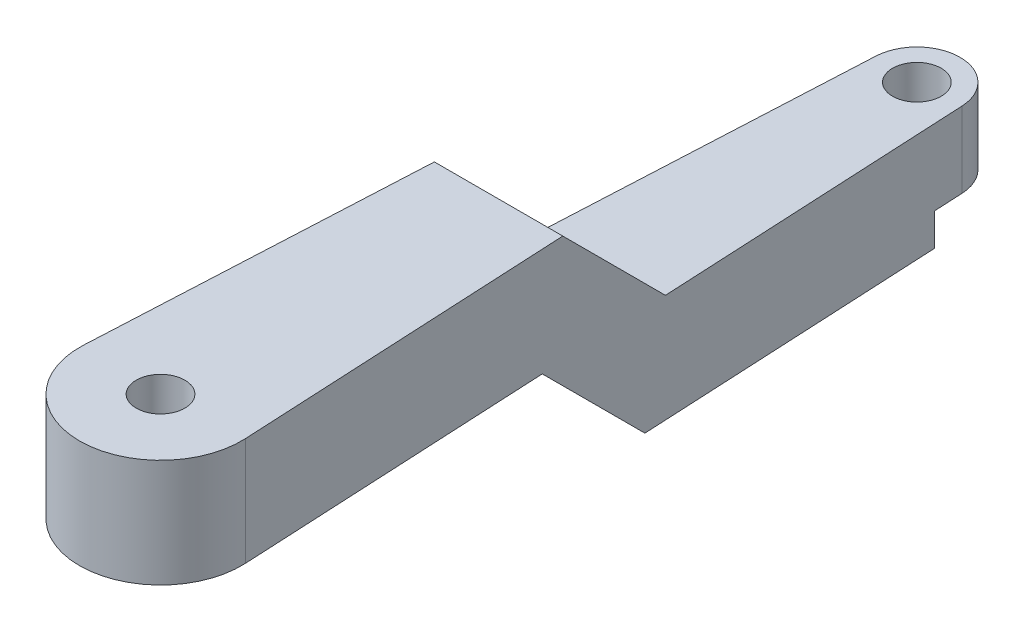
ISO-10303-21;
HEADER;
FILE_DESCRIPTION(('STEP AP214'),'2;1');
FILE_NAME('part.step','',(''),(''),'','','');
FILE_SCHEMA(('AUTOMOTIVE_DESIGN { 1 0 10303 214 1 1 1 1 }'));
ENDSEC;
DATA;
#1=APPLICATION_CONTEXT('core data for automotive mechanical design processes');
#2=APPLICATION_PROTOCOL_DEFINITION('international standard','automotive_design',2000,#1);
#3=PRODUCT_CONTEXT('',#1,'mechanical');
#4=PRODUCT('Part','Part','',(#3));
#5=PRODUCT_RELATED_PRODUCT_CATEGORY('part','',(#4));
#6=PRODUCT_DEFINITION_FORMATION('','',#4);
#7=PRODUCT_DEFINITION_CONTEXT('part definition',#1,'design');
#8=PRODUCT_DEFINITION('design','',#6,#7);
#9=PRODUCT_DEFINITION_SHAPE('','',#8);
#10=(LENGTH_UNIT() NAMED_UNIT(*) SI_UNIT(.MILLI.,.METRE.));
#11=(NAMED_UNIT(*) PLANE_ANGLE_UNIT() SI_UNIT($,.RADIAN.));
#12=(NAMED_UNIT(*) SI_UNIT($,.STERADIAN.) SOLID_ANGLE_UNIT());
#13=UNCERTAINTY_MEASURE_WITH_UNIT(LENGTH_MEASURE(1.E-05),#10,'distance_accuracy_value','');
#14=(GEOMETRIC_REPRESENTATION_CONTEXT(3) GLOBAL_UNCERTAINTY_ASSIGNED_CONTEXT((#13)) GLOBAL_UNIT_ASSIGNED_CONTEXT((#10,
#11,#12)) REPRESENTATION_CONTEXT('',''));
#15=CARTESIAN_POINT('',(0.,0.,0.));
#16=DIRECTION('',(0.,0.,1.));
#17=DIRECTION('',(1.,0.,0.));
#18=AXIS2_PLACEMENT_3D('',#15,#16,#17);
#19=CARTESIAN_POINT('',(0.,10.,-35.));
#20=DIRECTION('',(0.,-1.,0.));
#21=DIRECTION('',(0.,0.,-1.));
#22=AXIS2_PLACEMENT_3D('',#19,#20,#21);
#23=CYLINDRICAL_SURFACE('',#22,1.125);
#24=CARTESIAN_POINT('',(0.,5.,-35.));
#25=DIRECTION('',(0.,1.,0.));
#26=DIRECTION('',(0.,0.,1.));
#27=AXIS2_PLACEMENT_3D('',#24,#25,#26);
#28=CIRCLE('',#27,1.125);
#29=CARTESIAN_POINT('',(0.,5.,-33.875));
#30=VERTEX_POINT('',#29);
#31=EDGE_CURVE('E217',#30,#30,#28,.F.);
#32=ORIENTED_EDGE('',*,*,#31,.F.);
#33=EDGE_LOOP('',(#32));
#34=FACE_BOUND('',#33,.T.);
#35=CARTESIAN_POINT('',(0.,1.5,-35.));
#36=DIRECTION('',(0.,-1.,0.));
#37=DIRECTION('',(0.,0.,-1.));
#38=AXIS2_PLACEMENT_3D('',#35,#36,#37);
#39=CIRCLE('',#38,1.125);
#40=CARTESIAN_POINT('',(0.,1.5,-36.125));
#41=VERTEX_POINT('',#40);
#42=EDGE_CURVE('E179',#41,#41,#39,.T.);
#43=ORIENTED_EDGE('',*,*,#42,.T.);
#44=EDGE_LOOP('',(#43));
#45=FACE_BOUND('',#44,.T.);
#46=ADVANCED_FACE('F58',(#34,#45),#23,.F.);
#47=CARTESIAN_POINT('',(0.,10.,-35.));
#48=DIRECTION('',(0.,-1.,0.));
#49=DIRECTION('',(0.,0.,-1.));
#50=AXIS2_PLACEMENT_3D('',#47,#48,#49);
#51=CYLINDRICAL_SURFACE('',#50,2.);
#52=CARTESIAN_POINT('',(0.,1.5,-35.));
#53=DIRECTION('',(0.,-1.,0.));
#54=DIRECTION('',(0.,0.,-1.));
#55=AXIS2_PLACEMENT_3D('',#52,#53,#54);
#56=CIRCLE('',#55,2.);
#57=CARTESIAN_POINT('',(-1.99749843554382,1.5,-35.1));
#58=VERTEX_POINT('',#57);
#59=CARTESIAN_POINT('',(1.99749843554382,1.5,-35.1));
#60=VERTEX_POINT('',#59);
#61=EDGE_CURVE('E173',#58,#60,#56,.T.);
#62=ORIENTED_EDGE('',*,*,#61,.F.);
#63=DIRECTION('',(0.,-1.,0.));
#64=VECTOR('',#63,1.);
#65=CARTESIAN_POINT('',(-1.99749843554382,10.,-35.1));
#66=LINE('',#65,#64);
#67=CARTESIAN_POINT('',(-1.99749843554382,5.,-35.1));
#68=VERTEX_POINT('',#67);
#69=EDGE_CURVE('E236',#68,#58,#66,.T.);
#70=ORIENTED_EDGE('',*,*,#69,.F.);
#71=CARTESIAN_POINT('',(0.,5.,-35.));
#72=DIRECTION('',(0.,1.,0.));
#73=DIRECTION('',(0.,0.,1.));
#74=AXIS2_PLACEMENT_3D('',#71,#72,#73);
#75=CIRCLE('',#74,2.);
#76=CARTESIAN_POINT('',(1.99749843554382,5.,-35.1));
#77=VERTEX_POINT('',#76);
#78=EDGE_CURVE('E206',#77,#68,#75,.T.);
#79=ORIENTED_EDGE('',*,*,#78,.F.);
#80=DIRECTION('',(0.,-1.,0.));
#81=VECTOR('',#80,1.);
#82=CARTESIAN_POINT('',(1.99749843554382,10.,-35.1));
#83=LINE('',#82,#81);
#84=EDGE_CURVE('E246',#77,#60,#83,.T.);
#85=ORIENTED_EDGE('',*,*,#84,.T.);
#86=EDGE_LOOP('',(#62,#70,#79,#85));
#87=FACE_BOUND('',#86,.T.);
#88=ADVANCED_FACE('F311',(#87),#51,.T.);
#89=CARTESIAN_POINT('',(-3.74530956664466,10.,-0.1875));
#90=DIRECTION('',(-0.998749217771909,0.,-0.05));
#91=DIRECTION('',(-0.05,0.,0.998749217771909));
#92=AXIS2_PLACEMENT_3D('',#89,#90,#91);
#93=PLANE('',#92);
#94=DIRECTION('',(0.,1.,0.));
#95=VECTOR('',#94,1.);
#96=CARTESIAN_POINT('',(-2.06564068848819,10.,-33.7388595634918));
#97=LINE('',#96,#95);
#98=CARTESIAN_POINT('',(-2.06564068848819,0.,-33.7388595634918));
#99=VERTEX_POINT('',#98);
#100=CARTESIAN_POINT('',(-2.0656406884882,1.5,-33.7388595634918));
#101=VERTEX_POINT('',#100);
#102=EDGE_CURVE('E159',#99,#101,#97,.T.);
#103=ORIENTED_EDGE('',*,*,#102,.F.);
#104=DIRECTION('',(0.05,0.,-0.998749217771909));
#105=VECTOR('',#104,1.);
#106=CARTESIAN_POINT('',(-3.74530956664466,0.,-0.1875));
#107=LINE('',#106,#105);
#108=CARTESIAN_POINT('',(-2.77127876622989,0.,-19.64375));
#109=VERTEX_POINT('',#108);
#110=EDGE_CURVE('E221',#109,#99,#107,.T.);
#111=ORIENTED_EDGE('',*,*,#110,.F.);
#112=DIRECTION('',(0.0353774568838613,-0.706664147790316,-0.706664147790319));
#113=VECTOR('',#112,1.);
#114=CARTESIAN_POINT('',(-3.50890350179971,14.7340425531915,-4.90970744680848));
#115=LINE('',#114,#113);
#116=CARTESIAN_POINT('',(-3.02159185339076,5.,-14.64375));
#117=VERTEX_POINT('',#116);
#118=EDGE_CURVE('E270',#109,#117,#115,.F.);
#119=ORIENTED_EDGE('',*,*,#118,.T.);
#120=DIRECTION('',(-0.05,0.,0.998749217771909));
#121=VECTOR('',#120,1.);
#122=CARTESIAN_POINT('',(-3.74530956664466,5.,-0.1875));
#123=LINE('',#122,#121);
#124=CARTESIAN_POINT('',(-3.74530956664466,5.,-0.187500000000002));
#125=VERTEX_POINT('',#124);
#126=EDGE_CURVE('E199',#117,#125,#123,.T.);
#127=ORIENTED_EDGE('',*,*,#126,.T.);
#128=DIRECTION('',(0.,-1.,0.));
#129=VECTOR('',#128,1.);
#130=CARTESIAN_POINT('',(-3.74530956664466,10.,-0.1875));
#131=LINE('',#130,#129);
#132=CARTESIAN_POINT('',(-3.74530956664466,10.,-0.1875));
#133=VERTEX_POINT('',#132);
#134=EDGE_CURVE('E254',#133,#125,#131,.T.);
#135=ORIENTED_EDGE('',*,*,#134,.F.);
#136=DIRECTION('',(0.05,0.,-0.998749217771909));
#137=VECTOR('',#136,1.);
#138=CARTESIAN_POINT('',(-3.74530956664466,10.,-0.1875));
#139=LINE('',#138,#137);
#140=CARTESIAN_POINT('',(-2.97152923595859,10.,-15.64375));
#141=VERTEX_POINT('',#140);
#142=EDGE_CURVE('E222',#133,#141,#139,.T.);
#143=ORIENTED_EDGE('',*,*,#142,.T.);
#144=DIRECTION('',(0.0353774568838613,-0.706664147790316,-0.706664147790319));
#145=VECTOR('',#144,1.);
#146=CARTESIAN_POINT('',(-3.35890361928078,17.7377972465582,-7.90595275344176));
#147=LINE('',#146,#145);
#148=CARTESIAN_POINT('',(-2.72121614879771,5.,-20.64375));
#149=VERTEX_POINT('',#148);
#150=EDGE_CURVE('E267',#141,#149,#147,.T.);
#151=ORIENTED_EDGE('',*,*,#150,.T.);
#152=DIRECTION('',(-0.05,0.,0.998749217771909));
#153=VECTOR('',#152,1.);
#154=CARTESIAN_POINT('',(-3.74530956664466,5.,-0.1875));
#155=LINE('',#154,#153);
#156=EDGE_CURVE('E209',#68,#149,#155,.T.);
#157=ORIENTED_EDGE('',*,*,#156,.F.);
#158=ORIENTED_EDGE('',*,*,#69,.T.);
#159=DIRECTION('',(-0.05,0.,0.998749217771909));
#160=VECTOR('',#159,1.);
#161=CARTESIAN_POINT('',(-3.74530956664466,1.5,-0.1875));
#162=LINE('',#161,#160);
#163=EDGE_CURVE('E176',#58,#101,#162,.T.);
#164=ORIENTED_EDGE('',*,*,#163,.T.);
#165=EDGE_LOOP('',(#103,#111,#119,#127,#135,#143,#151,#157,#158,#164));
#166=FACE_BOUND('',#165,.T.);
#167=ADVANCED_FACE('F290',(#166),#93,.T.);
#168=CARTESIAN_POINT('',(0.,10.,0.));
#169=DIRECTION('',(0.,-1.,0.));
#170=DIRECTION('',(0.,0.,-1.));
#171=AXIS2_PLACEMENT_3D('',#168,#169,#170);
#172=CYLINDRICAL_SURFACE('',#171,3.75);
#173=ORIENTED_EDGE('',*,*,#134,.T.);
#174=CARTESIAN_POINT('',(0.,5.,0.));
#175=DIRECTION('',(0.,1.,0.));
#176=DIRECTION('',(0.,0.,1.));
#177=AXIS2_PLACEMENT_3D('',#174,#175,#176);
#178=CIRCLE('',#177,3.75);
#179=CARTESIAN_POINT('',(3.74530956664466,5.,-0.187500000000001));
#180=VERTEX_POINT('',#179);
#181=EDGE_CURVE('E195',#125,#180,#178,.T.);
#182=ORIENTED_EDGE('',*,*,#181,.T.);
#183=DIRECTION('',(0.,-1.,0.));
#184=VECTOR('',#183,1.);
#185=CARTESIAN_POINT('',(3.74530956664466,10.,-0.1875));
#186=LINE('',#185,#184);
#187=CARTESIAN_POINT('',(3.74530956664466,10.,-0.1875));
#188=VERTEX_POINT('',#187);
#189=EDGE_CURVE('E250',#188,#180,#186,.T.);
#190=ORIENTED_EDGE('',*,*,#189,.F.);
#191=CARTESIAN_POINT('',(0.,10.,0.));
#192=DIRECTION('',(0.,1.,0.));
#193=DIRECTION('',(0.,0.,1.));
#194=AXIS2_PLACEMENT_3D('',#191,#192,#193);
#195=CIRCLE('',#194,3.75);
#196=EDGE_CURVE('E225',#133,#188,#195,.T.);
#197=ORIENTED_EDGE('',*,*,#196,.F.);
#198=EDGE_LOOP('',(#173,#182,#190,#197));
#199=FACE_BOUND('',#198,.T.);
#200=ADVANCED_FACE('F294',(#199),#172,.T.);
#201=CARTESIAN_POINT('',(3.74530956664466,10.,-0.1875));
#202=DIRECTION('',(-0.998749217771909,0.,0.05));
#203=DIRECTION('',(0.05,0.,0.998749217771909));
#204=AXIS2_PLACEMENT_3D('',#201,#202,#203);
#205=PLANE('',#204);
#206=DIRECTION('',(-0.05,0.,-0.998749217771909));
#207=VECTOR('',#206,1.);
#208=CARTESIAN_POINT('',(3.74530956664466,0.,-0.1875));
#209=LINE('',#208,#207);
#210=CARTESIAN_POINT('',(2.77127876622989,0.,-19.64375));
#211=VERTEX_POINT('',#210);
#212=CARTESIAN_POINT('',(2.06564068848819,0.,-33.7388595634918));
#213=VERTEX_POINT('',#212);
#214=EDGE_CURVE('E226',#211,#213,#209,.T.);
#215=ORIENTED_EDGE('',*,*,#214,.T.);
#216=DIRECTION('',(0.,1.,0.));
#217=VECTOR('',#216,1.);
#218=CARTESIAN_POINT('',(2.06564068848819,10.,-33.7388595634918));
#219=LINE('',#218,#217);
#220=CARTESIAN_POINT('',(2.06564068848819,1.5,-33.7388595634918));
#221=VERTEX_POINT('',#220);
#222=EDGE_CURVE('E170',#213,#221,#219,.T.);
#223=ORIENTED_EDGE('',*,*,#222,.T.);
#224=DIRECTION('',(0.05,0.,0.998749217771909));
#225=VECTOR('',#224,1.);
#226=CARTESIAN_POINT('',(3.74530956664466,1.5,-0.1875));
#227=LINE('',#226,#225);
#228=EDGE_CURVE('E12',#60,#221,#227,.T.);
#229=ORIENTED_EDGE('',*,*,#228,.F.);
#230=ORIENTED_EDGE('',*,*,#84,.F.);
#231=DIRECTION('',(-0.05,0.,-0.998749217771909));
#232=VECTOR('',#231,1.);
#233=CARTESIAN_POINT('',(3.74530956664466,5.,-0.1875));
#234=LINE('',#233,#232);
#235=CARTESIAN_POINT('',(2.72121614879771,5.,-20.64375));
#236=VERTEX_POINT('',#235);
#237=EDGE_CURVE('E203',#236,#77,#234,.T.);
#238=ORIENTED_EDGE('',*,*,#237,.F.);
#239=DIRECTION('',(0.0353774568838613,0.706664147790316,0.706664147790319));
#240=VECTOR('',#239,1.);
#241=CARTESIAN_POINT('',(2.71781037138995,4.93196964956195,-20.711780350438));
#242=LINE('',#241,#240);
#243=CARTESIAN_POINT('',(2.97152923595859,10.,-15.64375));
#244=VERTEX_POINT('',#243);
#245=EDGE_CURVE('E258',#236,#244,#242,.T.);
#246=ORIENTED_EDGE('',*,*,#245,.T.);
#247=DIRECTION('',(-0.05,0.,-0.998749217771909));
#248=VECTOR('',#247,1.);
#249=CARTESIAN_POINT('',(3.74530956664466,10.,-0.1875));
#250=LINE('',#249,#248);
#251=EDGE_CURVE('E229',#188,#244,#250,.T.);
#252=ORIENTED_EDGE('',*,*,#251,.F.);
#253=ORIENTED_EDGE('',*,*,#189,.T.);
#254=DIRECTION('',(-0.05,0.,-0.998749217771909));
#255=VECTOR('',#254,1.);
#256=CARTESIAN_POINT('',(3.74530956664466,5.,-0.1875));
#257=LINE('',#256,#255);
#258=CARTESIAN_POINT('',(3.02159185339076,5.,-14.64375));
#259=VERTEX_POINT('',#258);
#260=EDGE_CURVE('E191',#180,#259,#257,.T.);
#261=ORIENTED_EDGE('',*,*,#260,.T.);
#262=DIRECTION('',(0.0353774568838613,0.706664147790316,0.706664147790319));
#263=VECTOR('',#262,1.);
#264=CARTESIAN_POINT('',(3.01781013642782,4.92446026282854,-14.7192897371715));
#265=LINE('',#264,#263);
#266=EDGE_CURVE('E261',#259,#211,#265,.F.);
#267=ORIENTED_EDGE('',*,*,#266,.T.);
#268=EDGE_LOOP('',(#215,#223,#229,#230,#238,#246,#252,#253,#261,#267));
#269=FACE_BOUND('',#268,.T.);
#270=ADVANCED_FACE('F280',(#269),#205,.F.);
#271=CARTESIAN_POINT('',(0.,10.,0.));
#272=DIRECTION('',(0.,-1.,0.));
#273=DIRECTION('',(0.,0.,-1.));
#274=AXIS2_PLACEMENT_3D('',#271,#272,#273);
#275=CYLINDRICAL_SURFACE('',#274,1.125);
#276=CARTESIAN_POINT('',(0.,5.,0.));
#277=DIRECTION('',(0.,1.,0.));
#278=DIRECTION('',(0.,0.,1.));
#279=AXIS2_PLACEMENT_3D('',#276,#277,#278);
#280=CIRCLE('',#279,1.125);
#281=CARTESIAN_POINT('',(0.,5.,1.125));
#282=VERTEX_POINT('',#281);
#283=EDGE_CURVE('E183',#282,#282,#280,.T.);
#284=ORIENTED_EDGE('',*,*,#283,.F.);
#285=EDGE_LOOP('',(#284));
#286=FACE_BOUND('',#285,.T.);
#287=CARTESIAN_POINT('',(0.,10.,0.));
#288=DIRECTION('',(0.,1.,0.));
#289=DIRECTION('',(0.,0.,1.));
#290=AXIS2_PLACEMENT_3D('',#287,#288,#289);
#291=CIRCLE('',#290,1.125);
#292=CARTESIAN_POINT('',(0.,10.,1.125));
#293=VERTEX_POINT('',#292);
#294=EDGE_CURVE('E232',#293,#293,#291,.T.);
#295=ORIENTED_EDGE('',*,*,#294,.T.);
#296=EDGE_LOOP('',(#295));
#297=FACE_BOUND('',#296,.T.);
#298=ADVANCED_FACE('F326',(#286,#297),#275,.F.);
#299=CARTESIAN_POINT('',(0.,10.,0.));
#300=DIRECTION('',(0.,1.,0.));
#301=DIRECTION('',(0.,0.,1.));
#302=AXIS2_PLACEMENT_3D('',#299,#300,#301);
#303=PLANE('',#302);
#304=ORIENTED_EDGE('',*,*,#251,.T.);
#305=DIRECTION('',(-1.,0.,0.));
#306=VECTOR('',#305,1.);
#307=CARTESIAN_POINT('',(-2.72121614879771,10.,-15.64375));
#308=LINE('',#307,#306);
#309=EDGE_CURVE('E83',#244,#141,#308,.T.);
#310=ORIENTED_EDGE('',*,*,#309,.T.);
#311=ORIENTED_EDGE('',*,*,#142,.F.);
#312=ORIENTED_EDGE('',*,*,#196,.T.);
#313=EDGE_LOOP('',(#304,#310,#311,#312));
#314=FACE_BOUND('',#313,.T.);
#315=ORIENTED_EDGE('',*,*,#294,.F.);
#316=EDGE_LOOP('',(#315));
#317=FACE_BOUND('',#316,.T.);
#318=ADVANCED_FACE('F297',(#314,#317),#303,.T.);
#319=CARTESIAN_POINT('',(0.,0.,0.));
#320=DIRECTION('',(0.,1.,0.));
#321=DIRECTION('',(0.,0.,1.));
#322=AXIS2_PLACEMENT_3D('',#319,#320,#321);
#323=PLANE('',#322);
#324=DIRECTION('',(-0.866025403784439,0.,-0.499999999999999));
#325=VECTOR('',#324,1.);
#326=CARTESIAN_POINT('',(0.,0.,-32.5462613559441));
#327=LINE('',#326,#325);
#328=CARTESIAN_POINT('',(0.,0.,-32.5462613559441));
#329=VERTEX_POINT('',#328);
#330=EDGE_CURVE('E153',#329,#99,#327,.T.);
#331=ORIENTED_EDGE('',*,*,#330,.F.);
#332=DIRECTION('',(0.866025403784439,0.,-0.499999999999999));
#333=VECTOR('',#332,1.);
#334=CARTESIAN_POINT('',(-14.0929445662277,0.,-24.4096960169581));
#335=LINE('',#334,#333);
#336=EDGE_CURVE('E68',#329,#213,#335,.T.);
#337=ORIENTED_EDGE('',*,*,#336,.T.);
#338=ORIENTED_EDGE('',*,*,#214,.F.);
#339=DIRECTION('',(-1.,0.,0.));
#340=VECTOR('',#339,1.);
#341=CARTESIAN_POINT('',(0.,0.,-19.64375));
#342=LINE('',#341,#340);
#343=EDGE_CURVE('E264',#211,#109,#342,.T.);
#344=ORIENTED_EDGE('',*,*,#343,.T.);
#345=ORIENTED_EDGE('',*,*,#110,.T.);
#346=EDGE_LOOP('',(#331,#337,#338,#344,#345));
#347=FACE_BOUND('',#346,.T.);
#348=ADVANCED_FACE('F277',(#347),#323,.F.);
#349=CARTESIAN_POINT('',(0.,5.,0.));
#350=DIRECTION('',(0.,1.,0.));
#351=DIRECTION('',(0.,0.,1.));
#352=AXIS2_PLACEMENT_3D('',#349,#350,#351);
#353=PLANE('',#352);
#354=ORIENTED_EDGE('',*,*,#237,.T.);
#355=ORIENTED_EDGE('',*,*,#78,.T.);
#356=ORIENTED_EDGE('',*,*,#156,.T.);
#357=DIRECTION('',(1.,0.,0.));
#358=VECTOR('',#357,1.);
#359=CARTESIAN_POINT('',(0.,5.,-20.64375));
#360=LINE('',#359,#358);
#361=EDGE_CURVE('E213',#149,#236,#360,.T.);
#362=ORIENTED_EDGE('',*,*,#361,.T.);
#363=EDGE_LOOP('',(#354,#355,#356,#362));
#364=FACE_BOUND('',#363,.T.);
#365=ORIENTED_EDGE('',*,*,#31,.T.);
#366=EDGE_LOOP('',(#365));
#367=FACE_BOUND('',#366,.T.);
#368=ADVANCED_FACE('F305',(#364,#367),#353,.T.);
#369=CARTESIAN_POINT('',(0.,5.,0.));
#370=DIRECTION('',(0.,1.,0.));
#371=DIRECTION('',(0.,0.,1.));
#372=AXIS2_PLACEMENT_3D('',#369,#370,#371);
#373=PLANE('',#372);
#374=DIRECTION('',(1.,0.,0.));
#375=VECTOR('',#374,1.);
#376=CARTESIAN_POINT('',(0.,5.,-14.64375));
#377=LINE('',#376,#375);
#378=EDGE_CURVE('E187',#117,#259,#377,.T.);
#379=ORIENTED_EDGE('',*,*,#378,.T.);
#380=ORIENTED_EDGE('',*,*,#260,.F.);
#381=ORIENTED_EDGE('',*,*,#181,.F.);
#382=ORIENTED_EDGE('',*,*,#126,.F.);
#383=EDGE_LOOP('',(#379,#380,#381,#382));
#384=FACE_BOUND('',#383,.T.);
#385=ORIENTED_EDGE('',*,*,#283,.T.);
#386=EDGE_LOOP('',(#385));
#387=FACE_BOUND('',#386,.T.);
#388=ADVANCED_FACE('F287',(#384,#387),#373,.F.);
#389=CARTESIAN_POINT('',(0.,5.,-14.64375));
#390=DIRECTION('',(0.,0.707106781186549,-0.707106781186546));
#391=DIRECTION('',(1.,0.,0.));
#392=AXIS2_PLACEMENT_3D('',#389,#390,#391);
#393=PLANE('',#392);
#394=ORIENTED_EDGE('',*,*,#118,.F.);
#395=ORIENTED_EDGE('',*,*,#343,.F.);
#396=ORIENTED_EDGE('',*,*,#266,.F.);
#397=ORIENTED_EDGE('',*,*,#378,.F.);
#398=EDGE_LOOP('',(#394,#395,#396,#397));
#399=FACE_BOUND('',#398,.T.);
#400=ADVANCED_FACE('F284',(#399),#393,.F.);
#401=CARTESIAN_POINT('',(0.,5.,-20.64375));
#402=DIRECTION('',(0.,0.707106781186549,-0.707106781186546));
#403=DIRECTION('',(-1.,0.,0.));
#404=AXIS2_PLACEMENT_3D('',#401,#402,#403);
#405=PLANE('',#404);
#406=ORIENTED_EDGE('',*,*,#150,.F.);
#407=ORIENTED_EDGE('',*,*,#309,.F.);
#408=ORIENTED_EDGE('',*,*,#245,.F.);
#409=ORIENTED_EDGE('',*,*,#361,.F.);
#410=EDGE_LOOP('',(#406,#407,#408,#409));
#411=FACE_BOUND('',#410,.T.);
#412=ADVANCED_FACE('F61',(#411),#405,.T.);
#413=CARTESIAN_POINT('',(2.125,1.5,-33.773130677972));
#414=DIRECTION('',(0.499999999999999,0.,0.866025403784439));
#415=DIRECTION('',(0.866025403784439,0.,-0.499999999999999));
#416=AXIS2_PLACEMENT_3D('',#413,#414,#415);
#417=PLANE('',#416);
#418=ORIENTED_EDGE('',*,*,#336,.F.);
#419=DIRECTION('',(0.,-1.,0.));
#420=VECTOR('',#419,1.);
#421=CARTESIAN_POINT('',(0.,1.5,-32.5462613559441));
#422=LINE('',#421,#420);
#423=CARTESIAN_POINT('',(0.,1.5,-32.5462613559441));
#424=VERTEX_POINT('',#423);
#425=EDGE_CURVE('E75',#424,#329,#422,.T.);
#426=ORIENTED_EDGE('',*,*,#425,.F.);
#427=DIRECTION('',(-0.866025403784439,0.,0.499999999999999));
#428=VECTOR('',#427,1.);
#429=CARTESIAN_POINT('',(2.125,1.5,-33.773130677972));
#430=LINE('',#429,#428);
#431=EDGE_CURVE('E145',#221,#424,#430,.T.);
#432=ORIENTED_EDGE('',*,*,#431,.F.);
#433=ORIENTED_EDGE('',*,*,#222,.F.);
#434=EDGE_LOOP('',(#418,#426,#432,#433));
#435=FACE_BOUND('',#434,.T.);
#436=ADVANCED_FACE('F155',(#435),#417,.F.);
#437=CARTESIAN_POINT('',(0.,1.5,-32.5462613559441));
#438=DIRECTION('',(-0.499999999999999,0.,0.866025403784439));
#439=DIRECTION('',(0.866025403784439,0.,0.499999999999999));
#440=AXIS2_PLACEMENT_3D('',#437,#438,#439);
#441=PLANE('',#440);
#442=ORIENTED_EDGE('',*,*,#102,.T.);
#443=DIRECTION('',(-0.866025403784439,0.,-0.499999999999999));
#444=VECTOR('',#443,1.);
#445=CARTESIAN_POINT('',(0.,1.5,-32.5462613559441));
#446=LINE('',#445,#444);
#447=EDGE_CURVE('E147',#424,#101,#446,.T.);
#448=ORIENTED_EDGE('',*,*,#447,.F.);
#449=ORIENTED_EDGE('',*,*,#425,.T.);
#450=ORIENTED_EDGE('',*,*,#330,.T.);
#451=EDGE_LOOP('',(#442,#448,#449,#450));
#452=FACE_BOUND('',#451,.T.);
#453=ADVANCED_FACE('F161',(#452),#441,.F.);
#454=CARTESIAN_POINT('',(0.,1.5,0.));
#455=DIRECTION('',(0.,-1.,0.));
#456=DIRECTION('',(0.,0.,-1.));
#457=AXIS2_PLACEMENT_3D('',#454,#455,#456);
#458=PLANE('',#457);
#459=ORIENTED_EDGE('',*,*,#42,.F.);
#460=EDGE_LOOP('',(#459));
#461=FACE_BOUND('',#460,.T.);
#462=ORIENTED_EDGE('',*,*,#61,.T.);
#463=ORIENTED_EDGE('',*,*,#228,.T.);
#464=ORIENTED_EDGE('',*,*,#431,.T.);
#465=ORIENTED_EDGE('',*,*,#447,.T.);
#466=ORIENTED_EDGE('',*,*,#163,.F.);
#467=EDGE_LOOP('',(#462,#463,#464,#465,#466));
#468=FACE_BOUND('',#467,.T.);
#469=ADVANCED_FACE('F146',(#461,#468),#458,.T.);
#470=CLOSED_SHELL('',(#46,#88,#167,#200,#270,#298,#318,#348,#368,#388,#400,#412,#436,#453,#469));
#471=MANIFOLD_SOLID_BREP('B2',#470);
#472=ADVANCED_BREP_SHAPE_REPRESENTATION('',(#18,#471),#14);
#473=SHAPE_DEFINITION_REPRESENTATION(#9,#472);
ENDSEC;
END-ISO-10303-21;
